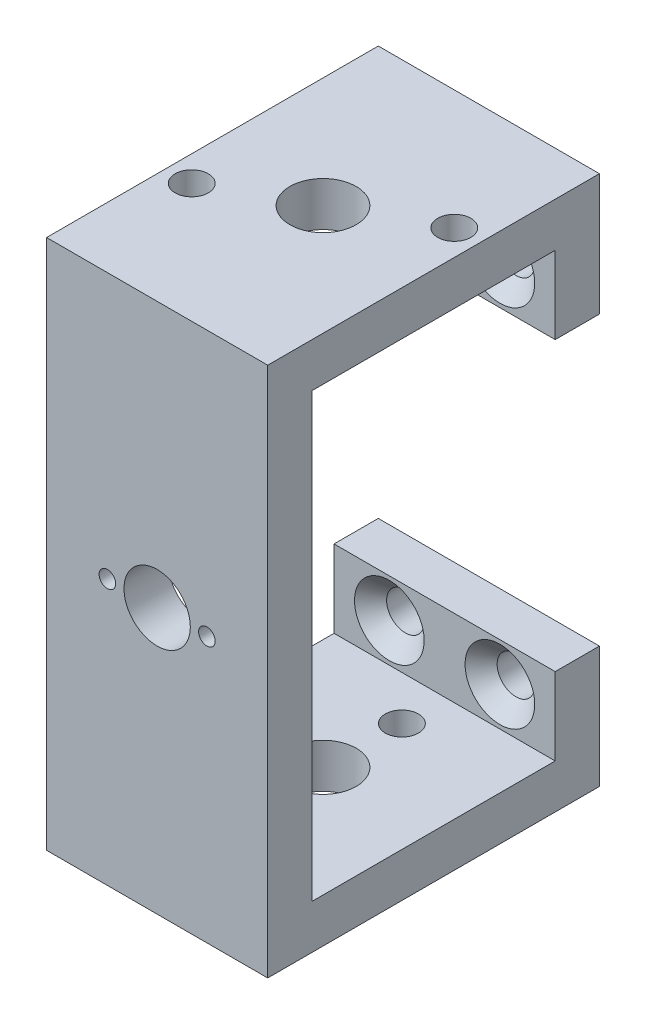
ISO-10303-21;
HEADER;
FILE_DESCRIPTION(('STEP AP214'),'2;1');
FILE_NAME('part.step','',(''),(''),'','','');
FILE_SCHEMA(('AUTOMOTIVE_DESIGN { 1 0 10303 214 1 1 1 1 }'));
ENDSEC;
DATA;
#1=APPLICATION_CONTEXT('core data for automotive mechanical design processes');
#2=APPLICATION_PROTOCOL_DEFINITION('international standard','automotive_design',2000,#1);
#3=PRODUCT_CONTEXT('',#1,'mechanical');
#4=PRODUCT('Part','Part','',(#3));
#5=PRODUCT_RELATED_PRODUCT_CATEGORY('part','',(#4));
#6=PRODUCT_DEFINITION_FORMATION('','',#4);
#7=PRODUCT_DEFINITION_CONTEXT('part definition',#1,'design');
#8=PRODUCT_DEFINITION('design','',#6,#7);
#9=PRODUCT_DEFINITION_SHAPE('','',#8);
#10=(LENGTH_UNIT() NAMED_UNIT(*) SI_UNIT(.MILLI.,.METRE.));
#11=(NAMED_UNIT(*) PLANE_ANGLE_UNIT() SI_UNIT($,.RADIAN.));
#12=(NAMED_UNIT(*) SI_UNIT($,.STERADIAN.) SOLID_ANGLE_UNIT());
#13=UNCERTAINTY_MEASURE_WITH_UNIT(LENGTH_MEASURE(1.E-05),#10,'distance_accuracy_value','');
#14=(GEOMETRIC_REPRESENTATION_CONTEXT(3) GLOBAL_UNCERTAINTY_ASSIGNED_CONTEXT((#13)) GLOBAL_UNIT_ASSIGNED_CONTEXT((#10,
#11,#12)) REPRESENTATION_CONTEXT('',''));
#15=CARTESIAN_POINT('',(0.,0.,0.));
#16=DIRECTION('',(0.,0.,1.));
#17=DIRECTION('',(1.,0.,0.));
#18=AXIS2_PLACEMENT_3D('',#15,#16,#17);
#19=CARTESIAN_POINT('',(20.,-34.,15.));
#20=DIRECTION('',(0.,1.,0.));
#21=DIRECTION('',(0.,0.,1.));
#22=AXIS2_PLACEMENT_3D('',#19,#20,#21);
#23=PLANE('',#22);
#24=CARTESIAN_POINT('',(9.86459769736454,-34.,6.9986903215131));
#25=DIRECTION('',(0.,-1.,0.));
#26=DIRECTION('',(0.,0.,-1.));
#27=AXIS2_PLACEMENT_3D('',#24,#25,#26);
#28=CIRCLE('',#27,1.5);
#29=CARTESIAN_POINT('',(9.86459769736454,-34.,5.4986903215131));
#30=VERTEX_POINT('',#29);
#31=EDGE_CURVE('E298',#30,#30,#28,.T.);
#32=ORIENTED_EDGE('',*,*,#31,.F.);
#33=EDGE_LOOP('',(#32));
#34=FACE_BOUND('',#33,.T.);
#35=CARTESIAN_POINT('',(10.1354023026356,-34.,-6.99869032151308));
#36=DIRECTION('',(0.,-1.,0.));
#37=DIRECTION('',(0.,0.,-1.));
#38=AXIS2_PLACEMENT_3D('',#35,#36,#37);
#39=CIRCLE('',#38,1.5);
#40=CARTESIAN_POINT('',(10.1354023026356,-34.,-8.49869032151308));
#41=VERTEX_POINT('',#40);
#42=EDGE_CURVE('E302',#41,#41,#39,.T.);
#43=ORIENTED_EDGE('',*,*,#42,.F.);
#44=EDGE_LOOP('',(#43));
#45=FACE_BOUND('',#44,.T.);
#46=CARTESIAN_POINT('',(10.,-34.,0.));
#47=DIRECTION('',(0.,1.,0.));
#48=DIRECTION('',(0.,0.,1.));
#49=AXIS2_PLACEMENT_3D('',#46,#47,#48);
#50=CIRCLE('',#49,3.);
#51=CARTESIAN_POINT('',(10.,-34.,3.));
#52=VERTEX_POINT('',#51);
#53=EDGE_CURVE('E257',#52,#52,#50,.T.);
#54=ORIENTED_EDGE('',*,*,#53,.T.);
#55=EDGE_LOOP('',(#54));
#56=FACE_BOUND('',#55,.T.);
#57=DIRECTION('',(0.,0.,-1.));
#58=VECTOR('',#57,1.);
#59=CARTESIAN_POINT('',(0.,-34.,15.));
#60=LINE('',#59,#58);
#61=CARTESIAN_POINT('',(0.,-34.,15.));
#62=VERTEX_POINT('',#61);
#63=CARTESIAN_POINT('',(0.,-34.,-15.));
#64=VERTEX_POINT('',#63);
#65=EDGE_CURVE('E184',#62,#64,#60,.T.);
#66=ORIENTED_EDGE('',*,*,#65,.T.);
#67=DIRECTION('',(-1.,0.,0.));
#68=VECTOR('',#67,1.);
#69=CARTESIAN_POINT('',(20.,-34.,-15.));
#70=LINE('',#69,#68);
#71=CARTESIAN_POINT('',(20.,-34.,-15.));
#72=VERTEX_POINT('',#71);
#73=EDGE_CURVE('E43',#72,#64,#70,.T.);
#74=ORIENTED_EDGE('',*,*,#73,.F.);
#75=DIRECTION('',(0.,0.,-1.));
#76=VECTOR('',#75,1.);
#77=CARTESIAN_POINT('',(20.,-34.,15.));
#78=LINE('',#77,#76);
#79=CARTESIAN_POINT('',(20.,-34.,15.));
#80=VERTEX_POINT('',#79);
#81=EDGE_CURVE('E225',#80,#72,#78,.T.);
#82=ORIENTED_EDGE('',*,*,#81,.F.);
#83=DIRECTION('',(-1.,0.,0.));
#84=VECTOR('',#83,1.);
#85=CARTESIAN_POINT('',(20.,-34.,15.));
#86=LINE('',#85,#84);
#87=EDGE_CURVE('E11',#80,#62,#86,.T.);
#88=ORIENTED_EDGE('',*,*,#87,.T.);
#89=EDGE_LOOP('',(#66,#74,#82,#88));
#90=FACE_BOUND('',#89,.T.);
#91=ADVANCED_FACE('F36',(#34,#45,#56,#90),#23,.F.);
#92=CARTESIAN_POINT('',(20.,-34.,-15.));
#93=DIRECTION('',(0.,0.,1.));
#94=DIRECTION('',(0.,-1.,0.));
#95=AXIS2_PLACEMENT_3D('',#92,#93,#94);
#96=PLANE('',#95);
#97=CARTESIAN_POINT('',(5.,-26.5,-15.));
#98=DIRECTION('',(0.,0.,1.));
#99=DIRECTION('',(0.,-1.,0.));
#100=AXIS2_PLACEMENT_3D('',#97,#98,#99);
#101=CIRCLE('',#100,1.7);
#102=CARTESIAN_POINT('',(5.,-28.2,-15.));
#103=VERTEX_POINT('',#102);
#104=EDGE_CURVE('E354',#103,#103,#101,.T.);
#105=ORIENTED_EDGE('',*,*,#104,.T.);
#106=EDGE_LOOP('',(#105));
#107=FACE_BOUND('',#106,.T.);
#108=CARTESIAN_POINT('',(15.,-26.5,-15.));
#109=DIRECTION('',(0.,0.,1.));
#110=DIRECTION('',(0.,-1.,0.));
#111=AXIS2_PLACEMENT_3D('',#108,#109,#110);
#112=CIRCLE('',#111,1.7);
#113=CARTESIAN_POINT('',(15.,-28.2,-15.));
#114=VERTEX_POINT('',#113);
#115=EDGE_CURVE('E345',#114,#114,#112,.T.);
#116=ORIENTED_EDGE('',*,*,#115,.T.);
#117=EDGE_LOOP('',(#116));
#118=FACE_BOUND('',#117,.T.);
#119=DIRECTION('',(0.,1.,0.));
#120=VECTOR('',#119,1.);
#121=CARTESIAN_POINT('',(0.,-34.,-15.));
#122=LINE('',#121,#120);
#123=CARTESIAN_POINT('',(0.,-23.,-15.));
#124=VERTEX_POINT('',#123);
#125=EDGE_CURVE('E178',#64,#124,#122,.T.);
#126=ORIENTED_EDGE('',*,*,#125,.T.);
#127=DIRECTION('',(1.,0.,0.));
#128=VECTOR('',#127,1.);
#129=CARTESIAN_POINT('',(0.,-23.,-15.));
#130=LINE('',#129,#128);
#131=CARTESIAN_POINT('',(20.,-23.,-15.));
#132=VERTEX_POINT('',#131);
#133=EDGE_CURVE('E50',#124,#132,#130,.T.);
#134=ORIENTED_EDGE('',*,*,#133,.T.);
#135=DIRECTION('',(0.,1.,0.));
#136=VECTOR('',#135,1.);
#137=CARTESIAN_POINT('',(20.,-34.,-15.));
#138=LINE('',#137,#136);
#139=EDGE_CURVE('E180',#72,#132,#138,.T.);
#140=ORIENTED_EDGE('',*,*,#139,.F.);
#141=ORIENTED_EDGE('',*,*,#73,.T.);
#142=EDGE_LOOP('',(#126,#134,#140,#141));
#143=FACE_BOUND('',#142,.T.);
#144=ADVANCED_FACE('F177',(#107,#118,#143),#96,.F.);
#145=CARTESIAN_POINT('',(20.,-20.,-11.));
#146=DIRECTION('',(0.,0.,-1.));
#147=DIRECTION('',(0.,1.,0.));
#148=AXIS2_PLACEMENT_3D('',#145,#146,#147);
#149=PLANE('',#148);
#150=CARTESIAN_POINT('',(5.,-26.5,-11.));
#151=DIRECTION('',(0.,0.,1.));
#152=DIRECTION('',(0.,-1.,0.));
#153=AXIS2_PLACEMENT_3D('',#150,#151,#152);
#154=CIRCLE('',#153,3.15);
#155=CARTESIAN_POINT('',(5.,-29.65,-11.));
#156=VERTEX_POINT('',#155);
#157=EDGE_CURVE('E360',#156,#156,#154,.T.);
#158=ORIENTED_EDGE('',*,*,#157,.F.);
#159=EDGE_LOOP('',(#158));
#160=FACE_BOUND('',#159,.T.);
#161=CARTESIAN_POINT('',(15.,-26.5,-11.));
#162=DIRECTION('',(0.,0.,1.));
#163=DIRECTION('',(0.,-1.,0.));
#164=AXIS2_PLACEMENT_3D('',#161,#162,#163);
#165=CIRCLE('',#164,3.15);
#166=CARTESIAN_POINT('',(15.,-29.65,-11.));
#167=VERTEX_POINT('',#166);
#168=EDGE_CURVE('E351',#167,#167,#165,.T.);
#169=ORIENTED_EDGE('',*,*,#168,.F.);
#170=EDGE_LOOP('',(#169));
#171=FACE_BOUND('',#170,.T.);
#172=DIRECTION('',(0.,-1.,0.));
#173=VECTOR('',#172,1.);
#174=CARTESIAN_POINT('',(20.,-20.,-11.));
#175=LINE('',#174,#173);
#176=CARTESIAN_POINT('',(20.,-23.,-11.));
#177=VERTEX_POINT('',#176);
#178=CARTESIAN_POINT('',(20.,-30.,-11.));
#179=VERTEX_POINT('',#178);
#180=EDGE_CURVE('E233',#177,#179,#175,.T.);
#181=ORIENTED_EDGE('',*,*,#180,.F.);
#182=DIRECTION('',(1.,0.,0.));
#183=VECTOR('',#182,1.);
#184=CARTESIAN_POINT('',(0.,-23.,-11.));
#185=LINE('',#184,#183);
#186=CARTESIAN_POINT('',(0.,-23.,-11.));
#187=VERTEX_POINT('',#186);
#188=EDGE_CURVE('E249',#187,#177,#185,.T.);
#189=ORIENTED_EDGE('',*,*,#188,.F.);
#190=DIRECTION('',(0.,-1.,0.));
#191=VECTOR('',#190,1.);
#192=CARTESIAN_POINT('',(0.,-20.,-11.));
#193=LINE('',#192,#191);
#194=CARTESIAN_POINT('',(0.,-30.,-11.));
#195=VERTEX_POINT('',#194);
#196=EDGE_CURVE('E187',#187,#195,#193,.T.);
#197=ORIENTED_EDGE('',*,*,#196,.T.);
#198=DIRECTION('',(-1.,0.,0.));
#199=VECTOR('',#198,1.);
#200=CARTESIAN_POINT('',(20.,-30.,-11.));
#201=LINE('',#200,#199);
#202=EDGE_CURVE('E169',#179,#195,#201,.T.);
#203=ORIENTED_EDGE('',*,*,#202,.F.);
#204=EDGE_LOOP('',(#181,#189,#197,#203));
#205=FACE_BOUND('',#204,.T.);
#206=ADVANCED_FACE('F247',(#160,#171,#205),#149,.F.);
#207=CARTESIAN_POINT('',(20.,-30.,-11.));
#208=DIRECTION('',(0.,-1.,0.));
#209=DIRECTION('',(0.,0.,-1.));
#210=AXIS2_PLACEMENT_3D('',#207,#208,#209);
#211=PLANE('',#210);
#212=CARTESIAN_POINT('',(9.86459769736454,-30.,6.9986903215131));
#213=DIRECTION('',(0.,-1.,0.));
#214=DIRECTION('',(0.,0.,-1.));
#215=AXIS2_PLACEMENT_3D('',#212,#213,#214);
#216=CIRCLE('',#215,1.5);
#217=CARTESIAN_POINT('',(9.86459769736454,-30.,5.4986903215131));
#218=VERTEX_POINT('',#217);
#219=EDGE_CURVE('E304',#218,#218,#216,.F.);
#220=ORIENTED_EDGE('',*,*,#219,.F.);
#221=EDGE_LOOP('',(#220));
#222=FACE_BOUND('',#221,.T.);
#223=CARTESIAN_POINT('',(10.1354023026356,-30.,-6.99869032151308));
#224=DIRECTION('',(0.,-1.,0.));
#225=DIRECTION('',(0.,0.,-1.));
#226=AXIS2_PLACEMENT_3D('',#223,#224,#225);
#227=CIRCLE('',#226,1.5);
#228=CARTESIAN_POINT('',(10.1354023026356,-30.,-8.49869032151308));
#229=VERTEX_POINT('',#228);
#230=EDGE_CURVE('E311',#229,#229,#227,.F.);
#231=ORIENTED_EDGE('',*,*,#230,.F.);
#232=EDGE_LOOP('',(#231));
#233=FACE_BOUND('',#232,.T.);
#234=CARTESIAN_POINT('',(10.,-30.,0.));
#235=DIRECTION('',(0.,-1.,0.));
#236=DIRECTION('',(0.,0.,-1.));
#237=AXIS2_PLACEMENT_3D('',#234,#235,#236);
#238=CIRCLE('',#237,3.);
#239=CARTESIAN_POINT('',(10.,-30.,-3.));
#240=VERTEX_POINT('',#239);
#241=EDGE_CURVE('E266',#240,#240,#238,.T.);
#242=ORIENTED_EDGE('',*,*,#241,.T.);
#243=EDGE_LOOP('',(#242));
#244=FACE_BOUND('',#243,.T.);
#245=DIRECTION('',(0.,0.,1.));
#246=VECTOR('',#245,1.);
#247=CARTESIAN_POINT('',(0.,-30.,-11.));
#248=LINE('',#247,#246);
#249=CARTESIAN_POINT('',(0.,-30.,11.));
#250=VERTEX_POINT('',#249);
#251=EDGE_CURVE('E189',#195,#250,#248,.T.);
#252=ORIENTED_EDGE('',*,*,#251,.T.);
#253=DIRECTION('',(-1.,0.,0.));
#254=VECTOR('',#253,1.);
#255=CARTESIAN_POINT('',(20.,-30.,11.));
#256=LINE('',#255,#254);
#257=CARTESIAN_POINT('',(20.,-30.,11.));
#258=VERTEX_POINT('',#257);
#259=EDGE_CURVE('E166',#258,#250,#256,.T.);
#260=ORIENTED_EDGE('',*,*,#259,.F.);
#261=DIRECTION('',(0.,0.,1.));
#262=VECTOR('',#261,1.);
#263=CARTESIAN_POINT('',(20.,-30.,-11.));
#264=LINE('',#263,#262);
#265=EDGE_CURVE('E235',#179,#258,#264,.T.);
#266=ORIENTED_EDGE('',*,*,#265,.F.);
#267=ORIENTED_EDGE('',*,*,#202,.T.);
#268=EDGE_LOOP('',(#252,#260,#266,#267));
#269=FACE_BOUND('',#268,.T.);
#270=ADVANCED_FACE('F243',(#222,#233,#244,#269),#211,.F.);
#271=CARTESIAN_POINT('',(20.,10.,11.));
#272=DIRECTION('',(0.,0.,1.));
#273=DIRECTION('',(0.,-1.,0.));
#274=AXIS2_PLACEMENT_3D('',#271,#272,#273);
#275=PLANE('',#274);
#276=CARTESIAN_POINT('',(5.49999999999999,-10.,11.));
#277=DIRECTION('',(0.,0.,1.));
#278=DIRECTION('',(0.,-1.,0.));
#279=AXIS2_PLACEMENT_3D('',#276,#277,#278);
#280=CIRCLE('',#279,0.75);
#281=CARTESIAN_POINT('',(5.49999999999999,-10.75,11.));
#282=VERTEX_POINT('',#281);
#283=EDGE_CURVE('E363',#282,#282,#280,.T.);
#284=ORIENTED_EDGE('',*,*,#283,.T.);
#285=EDGE_LOOP('',(#284));
#286=FACE_BOUND('',#285,.T.);
#287=CARTESIAN_POINT('',(14.5,-10.,11.));
#288=DIRECTION('',(0.,0.,1.));
#289=DIRECTION('',(0.,-1.,0.));
#290=AXIS2_PLACEMENT_3D('',#287,#288,#289);
#291=CIRCLE('',#290,0.75);
#292=CARTESIAN_POINT('',(14.5,-10.75,11.));
#293=VERTEX_POINT('',#292);
#294=EDGE_CURVE('E365',#293,#293,#291,.T.);
#295=ORIENTED_EDGE('',*,*,#294,.T.);
#296=EDGE_LOOP('',(#295));
#297=FACE_BOUND('',#296,.T.);
#298=CARTESIAN_POINT('',(10.,-10.,11.));
#299=DIRECTION('',(0.,0.,-1.));
#300=DIRECTION('',(0.,1.,0.));
#301=AXIS2_PLACEMENT_3D('',#298,#299,#300);
#302=CIRCLE('',#301,3.);
#303=CARTESIAN_POINT('',(10.,-7.,11.));
#304=VERTEX_POINT('',#303);
#305=EDGE_CURVE('E229',#304,#304,#302,.T.);
#306=ORIENTED_EDGE('',*,*,#305,.F.);
#307=EDGE_LOOP('',(#306));
#308=FACE_BOUND('',#307,.T.);
#309=DIRECTION('',(0.,1.,0.));
#310=VECTOR('',#309,1.);
#311=CARTESIAN_POINT('',(0.,10.,11.));
#312=LINE('',#311,#310);
#313=CARTESIAN_POINT('',(0.,10.,11.));
#314=VERTEX_POINT('',#313);
#315=EDGE_CURVE('E197',#250,#314,#312,.T.);
#316=ORIENTED_EDGE('',*,*,#315,.T.);
#317=DIRECTION('',(-1.,0.,0.));
#318=VECTOR('',#317,1.);
#319=CARTESIAN_POINT('',(20.,10.,11.));
#320=LINE('',#319,#318);
#321=CARTESIAN_POINT('',(20.,10.,11.));
#322=VERTEX_POINT('',#321);
#323=EDGE_CURVE('E163',#322,#314,#320,.T.);
#324=ORIENTED_EDGE('',*,*,#323,.F.);
#325=DIRECTION('',(0.,1.,0.));
#326=VECTOR('',#325,1.);
#327=CARTESIAN_POINT('',(20.,0.,11.));
#328=LINE('',#327,#326);
#329=EDGE_CURVE('E213',#258,#322,#328,.T.);
#330=ORIENTED_EDGE('',*,*,#329,.F.);
#331=ORIENTED_EDGE('',*,*,#259,.T.);
#332=EDGE_LOOP('',(#316,#324,#330,#331));
#333=FACE_BOUND('',#332,.T.);
#334=ADVANCED_FACE('F240',(#286,#297,#308,#333),#275,.F.);
#335=CARTESIAN_POINT('',(20.,10.,-11.));
#336=DIRECTION('',(0.,1.,0.));
#337=DIRECTION('',(0.,0.,1.));
#338=AXIS2_PLACEMENT_3D('',#335,#336,#337);
#339=PLANE('',#338);
#340=CARTESIAN_POINT('',(17.6795896515513,9.99999999999999,-4.19361452495285));
#341=DIRECTION('',(0.,1.,0.));
#342=DIRECTION('',(0.,0.,1.));
#343=AXIS2_PLACEMENT_3D('',#340,#341,#342);
#344=CIRCLE('',#343,1.5);
#345=CARTESIAN_POINT('',(17.6795896515513,9.99999999999999,-2.69361452495285));
#346=VERTEX_POINT('',#345);
#347=EDGE_CURVE('E319',#346,#346,#344,.F.);
#348=ORIENTED_EDGE('',*,*,#347,.F.);
#349=EDGE_LOOP('',(#348));
#350=FACE_BOUND('',#349,.T.);
#351=CARTESIAN_POINT('',(2.32041034844555,9.99999999999999,4.19361452492107));
#352=DIRECTION('',(0.,1.,0.));
#353=DIRECTION('',(0.,0.,1.));
#354=AXIS2_PLACEMENT_3D('',#351,#352,#353);
#355=CIRCLE('',#354,1.5);
#356=CARTESIAN_POINT('',(2.32041034844555,9.99999999999999,5.69361452492107));
#357=VERTEX_POINT('',#356);
#358=EDGE_CURVE('E320',#357,#357,#355,.F.);
#359=ORIENTED_EDGE('',*,*,#358,.F.);
#360=EDGE_LOOP('',(#359));
#361=FACE_BOUND('',#360,.T.);
#362=CARTESIAN_POINT('',(10.,9.99999999999999,0.));
#363=DIRECTION('',(0.,1.,0.));
#364=DIRECTION('',(0.,0.,1.));
#365=AXIS2_PLACEMENT_3D('',#362,#363,#364);
#366=CIRCLE('',#365,3.);
#367=CARTESIAN_POINT('',(10.,9.99999999999999,3.));
#368=VERTEX_POINT('',#367);
#369=EDGE_CURVE('E260',#368,#368,#366,.T.);
#370=ORIENTED_EDGE('',*,*,#369,.T.);
#371=EDGE_LOOP('',(#370));
#372=FACE_BOUND('',#371,.T.);
#373=DIRECTION('',(0.,0.,-1.));
#374=VECTOR('',#373,1.);
#375=CARTESIAN_POINT('',(0.,10.,-11.));
#376=LINE('',#375,#374);
#377=CARTESIAN_POINT('',(0.,10.,-11.));
#378=VERTEX_POINT('',#377);
#379=EDGE_CURVE('E148',#314,#378,#376,.T.);
#380=ORIENTED_EDGE('',*,*,#379,.T.);
#381=DIRECTION('',(-1.,0.,0.));
#382=VECTOR('',#381,1.);
#383=CARTESIAN_POINT('',(20.,10.,-11.));
#384=LINE('',#383,#382);
#385=CARTESIAN_POINT('',(20.,10.,-11.));
#386=VERTEX_POINT('',#385);
#387=EDGE_CURVE('E160',#386,#378,#384,.T.);
#388=ORIENTED_EDGE('',*,*,#387,.F.);
#389=DIRECTION('',(0.,0.,-1.));
#390=VECTOR('',#389,1.);
#391=CARTESIAN_POINT('',(20.,10.,-11.));
#392=LINE('',#391,#390);
#393=EDGE_CURVE('E210',#322,#386,#392,.T.);
#394=ORIENTED_EDGE('',*,*,#393,.F.);
#395=ORIENTED_EDGE('',*,*,#323,.T.);
#396=EDGE_LOOP('',(#380,#388,#394,#395));
#397=FACE_BOUND('',#396,.T.);
#398=ADVANCED_FACE('F201',(#350,#361,#372,#397),#339,.F.);
#399=CARTESIAN_POINT('',(20.,0.,-11.));
#400=DIRECTION('',(0.,0.,-1.));
#401=DIRECTION('',(0.,1.,0.));
#402=AXIS2_PLACEMENT_3D('',#399,#400,#401);
#403=PLANE('',#402);
#404=CARTESIAN_POINT('',(5.,6.5,-11.));
#405=DIRECTION('',(0.,0.,1.));
#406=DIRECTION('',(0.,-1.,0.));
#407=AXIS2_PLACEMENT_3D('',#404,#405,#406);
#408=CIRCLE('',#407,3.15);
#409=CARTESIAN_POINT('',(5.,3.35,-11.));
#410=VERTEX_POINT('',#409);
#411=EDGE_CURVE('E342',#410,#410,#408,.T.);
#412=ORIENTED_EDGE('',*,*,#411,.F.);
#413=EDGE_LOOP('',(#412));
#414=FACE_BOUND('',#413,.T.);
#415=CARTESIAN_POINT('',(15.,6.5,-11.));
#416=DIRECTION('',(0.,0.,1.));
#417=DIRECTION('',(0.,-1.,0.));
#418=AXIS2_PLACEMENT_3D('',#415,#416,#417);
#419=CIRCLE('',#418,3.15);
#420=CARTESIAN_POINT('',(15.,3.35,-11.));
#421=VERTEX_POINT('',#420);
#422=EDGE_CURVE('E333',#421,#421,#419,.T.);
#423=ORIENTED_EDGE('',*,*,#422,.F.);
#424=EDGE_LOOP('',(#423));
#425=FACE_BOUND('',#424,.T.);
#426=DIRECTION('',(0.,-1.,0.));
#427=VECTOR('',#426,1.);
#428=CARTESIAN_POINT('',(0.,0.,-11.));
#429=LINE('',#428,#427);
#430=CARTESIAN_POINT('',(0.,3.,-11.));
#431=VERTEX_POINT('',#430);
#432=EDGE_CURVE('E144',#378,#431,#429,.T.);
#433=ORIENTED_EDGE('',*,*,#432,.T.);
#434=DIRECTION('',(1.,0.,0.));
#435=VECTOR('',#434,1.);
#436=CARTESIAN_POINT('',(0.,3.,-11.));
#437=LINE('',#436,#435);
#438=CARTESIAN_POINT('',(20.,3.,-11.));
#439=VERTEX_POINT('',#438);
#440=EDGE_CURVE('E58',#431,#439,#437,.T.);
#441=ORIENTED_EDGE('',*,*,#440,.T.);
#442=DIRECTION('',(0.,-1.,0.));
#443=VECTOR('',#442,1.);
#444=CARTESIAN_POINT('',(20.,0.,-11.));
#445=LINE('',#444,#443);
#446=EDGE_CURVE('E208',#386,#439,#445,.T.);
#447=ORIENTED_EDGE('',*,*,#446,.F.);
#448=ORIENTED_EDGE('',*,*,#387,.T.);
#449=EDGE_LOOP('',(#433,#441,#447,#448));
#450=FACE_BOUND('',#449,.T.);
#451=ADVANCED_FACE('F206',(#414,#425,#450),#403,.F.);
#452=CARTESIAN_POINT('',(20.,14.,-15.));
#453=DIRECTION('',(0.,0.,1.));
#454=DIRECTION('',(1.,0.,0.));
#455=AXIS2_PLACEMENT_3D('',#452,#453,#454);
#456=PLANE('',#455);
#457=CARTESIAN_POINT('',(5.,6.5,-15.));
#458=DIRECTION('',(0.,0.,1.));
#459=DIRECTION('',(0.,-1.,0.));
#460=AXIS2_PLACEMENT_3D('',#457,#458,#459);
#461=CIRCLE('',#460,1.7);
#462=CARTESIAN_POINT('',(5.,4.80000000000001,-15.));
#463=VERTEX_POINT('',#462);
#464=EDGE_CURVE('E336',#463,#463,#461,.T.);
#465=ORIENTED_EDGE('',*,*,#464,.T.);
#466=EDGE_LOOP('',(#465));
#467=FACE_BOUND('',#466,.T.);
#468=CARTESIAN_POINT('',(15.,6.5,-15.));
#469=DIRECTION('',(0.,0.,1.));
#470=DIRECTION('',(0.,-1.,0.));
#471=AXIS2_PLACEMENT_3D('',#468,#469,#470);
#472=CIRCLE('',#471,1.7);
#473=CARTESIAN_POINT('',(15.,4.8,-15.));
#474=VERTEX_POINT('',#473);
#475=EDGE_CURVE('E323',#474,#474,#472,.T.);
#476=ORIENTED_EDGE('',*,*,#475,.T.);
#477=EDGE_LOOP('',(#476));
#478=FACE_BOUND('',#477,.T.);
#479=DIRECTION('',(0.,1.,0.));
#480=VECTOR('',#479,1.);
#481=CARTESIAN_POINT('',(20.,14.,-15.));
#482=LINE('',#481,#480);
#483=CARTESIAN_POINT('',(20.,3.,-15.));
#484=VERTEX_POINT('',#483);
#485=CARTESIAN_POINT('',(20.,14.,-15.));
#486=VERTEX_POINT('',#485);
#487=EDGE_CURVE('E138',#484,#486,#482,.T.);
#488=ORIENTED_EDGE('',*,*,#487,.F.);
#489=DIRECTION('',(1.,0.,0.));
#490=VECTOR('',#489,1.);
#491=CARTESIAN_POINT('',(0.,3.,-15.));
#492=LINE('',#491,#490);
#493=CARTESIAN_POINT('',(0.,3.,-15.));
#494=VERTEX_POINT('',#493);
#495=EDGE_CURVE('E124',#494,#484,#492,.T.);
#496=ORIENTED_EDGE('',*,*,#495,.F.);
#497=DIRECTION('',(0.,1.,0.));
#498=VECTOR('',#497,1.);
#499=CARTESIAN_POINT('',(0.,14.,-15.));
#500=LINE('',#499,#498);
#501=CARTESIAN_POINT('',(0.,14.,-15.));
#502=VERTEX_POINT('',#501);
#503=EDGE_CURVE('E136',#494,#502,#500,.T.);
#504=ORIENTED_EDGE('',*,*,#503,.T.);
#505=DIRECTION('',(-1.,0.,0.));
#506=VECTOR('',#505,1.);
#507=CARTESIAN_POINT('',(20.,14.,-15.));
#508=LINE('',#507,#506);
#509=EDGE_CURVE('E157',#486,#502,#508,.T.);
#510=ORIENTED_EDGE('',*,*,#509,.F.);
#511=EDGE_LOOP('',(#488,#496,#504,#510));
#512=FACE_BOUND('',#511,.T.);
#513=ADVANCED_FACE('F134',(#467,#478,#512),#456,.F.);
#514=CARTESIAN_POINT('',(20.,14.,15.));
#515=DIRECTION('',(0.,-1.,0.));
#516=DIRECTION('',(0.,0.,-1.));
#517=AXIS2_PLACEMENT_3D('',#514,#515,#516);
#518=PLANE('',#517);
#519=CARTESIAN_POINT('',(17.6795896515513,14.,-4.19361452495285));
#520=DIRECTION('',(0.,1.,0.));
#521=DIRECTION('',(0.,0.,1.));
#522=AXIS2_PLACEMENT_3D('',#519,#520,#521);
#523=CIRCLE('',#522,1.5);
#524=CARTESIAN_POINT('',(17.6795896515513,14.,-2.69361452495285));
#525=VERTEX_POINT('',#524);
#526=EDGE_CURVE('E312',#525,#525,#523,.T.);
#527=ORIENTED_EDGE('',*,*,#526,.F.);
#528=EDGE_LOOP('',(#527));
#529=FACE_BOUND('',#528,.T.);
#530=CARTESIAN_POINT('',(2.32041034844555,14.,4.19361452492107));
#531=DIRECTION('',(0.,1.,0.));
#532=DIRECTION('',(0.,0.,1.));
#533=AXIS2_PLACEMENT_3D('',#530,#531,#532);
#534=CIRCLE('',#533,1.5);
#535=CARTESIAN_POINT('',(2.32041034844555,14.,5.69361452492107));
#536=VERTEX_POINT('',#535);
#537=EDGE_CURVE('E316',#536,#536,#534,.T.);
#538=ORIENTED_EDGE('',*,*,#537,.F.);
#539=EDGE_LOOP('',(#538));
#540=FACE_BOUND('',#539,.T.);
#541=CARTESIAN_POINT('',(10.,14.,0.));
#542=DIRECTION('',(0.,1.,0.));
#543=DIRECTION('',(0.,0.,1.));
#544=AXIS2_PLACEMENT_3D('',#541,#542,#543);
#545=CIRCLE('',#544,3.);
#546=CARTESIAN_POINT('',(10.,14.,3.));
#547=VERTEX_POINT('',#546);
#548=EDGE_CURVE('E261',#547,#547,#545,.T.);
#549=ORIENTED_EDGE('',*,*,#548,.F.);
#550=EDGE_LOOP('',(#549));
#551=FACE_BOUND('',#550,.T.);
#552=DIRECTION('',(0.,0.,1.));
#553=VECTOR('',#552,1.);
#554=CARTESIAN_POINT('',(0.,14.,15.));
#555=LINE('',#554,#553);
#556=CARTESIAN_POINT('',(0.,14.,15.));
#557=VERTEX_POINT('',#556);
#558=EDGE_CURVE('E143',#502,#557,#555,.T.);
#559=ORIENTED_EDGE('',*,*,#558,.T.);
#560=DIRECTION('',(-1.,0.,0.));
#561=VECTOR('',#560,1.);
#562=CARTESIAN_POINT('',(20.,14.,15.));
#563=LINE('',#562,#561);
#564=CARTESIAN_POINT('',(20.,14.,15.));
#565=VERTEX_POINT('',#564);
#566=EDGE_CURVE('E154',#565,#557,#563,.T.);
#567=ORIENTED_EDGE('',*,*,#566,.F.);
#568=DIRECTION('',(0.,0.,1.));
#569=VECTOR('',#568,1.);
#570=CARTESIAN_POINT('',(20.,14.,15.));
#571=LINE('',#570,#569);
#572=EDGE_CURVE('E158',#486,#565,#571,.T.);
#573=ORIENTED_EDGE('',*,*,#572,.F.);
#574=ORIENTED_EDGE('',*,*,#509,.T.);
#575=EDGE_LOOP('',(#559,#567,#573,#574));
#576=FACE_BOUND('',#575,.T.);
#577=ADVANCED_FACE('F222',(#529,#540,#551,#576),#518,.F.);
#578=CARTESIAN_POINT('',(20.,0.,15.));
#579=DIRECTION('',(0.,0.,-1.));
#580=DIRECTION('',(0.,1.,0.));
#581=AXIS2_PLACEMENT_3D('',#578,#579,#580);
#582=PLANE('',#581);
#583=CARTESIAN_POINT('',(5.49999999999999,-10.,15.));
#584=DIRECTION('',(0.,0.,1.));
#585=DIRECTION('',(1.,0.,0.));
#586=AXIS2_PLACEMENT_3D('',#583,#584,#585);
#587=CIRCLE('',#586,0.75);
#588=CARTESIAN_POINT('',(6.24999999999999,-10.,15.));
#589=VERTEX_POINT('',#588);
#590=EDGE_CURVE('E368',#589,#589,#587,.T.);
#591=ORIENTED_EDGE('',*,*,#590,.F.);
#592=EDGE_LOOP('',(#591));
#593=FACE_BOUND('',#592,.T.);
#594=CARTESIAN_POINT('',(14.5,-10.,15.));
#595=DIRECTION('',(0.,0.,1.));
#596=DIRECTION('',(1.,0.,0.));
#597=AXIS2_PLACEMENT_3D('',#594,#595,#596);
#598=CIRCLE('',#597,0.75);
#599=CARTESIAN_POINT('',(15.25,-10.,15.));
#600=VERTEX_POINT('',#599);
#601=EDGE_CURVE('E369',#600,#600,#598,.T.);
#602=ORIENTED_EDGE('',*,*,#601,.F.);
#603=EDGE_LOOP('',(#602));
#604=FACE_BOUND('',#603,.T.);
#605=CARTESIAN_POINT('',(10.,-10.,15.));
#606=DIRECTION('',(0.,0.,-1.));
#607=DIRECTION('',(0.,1.,0.));
#608=AXIS2_PLACEMENT_3D('',#605,#606,#607);
#609=CIRCLE('',#608,3.);
#610=CARTESIAN_POINT('',(10.,-7.,15.));
#611=VERTEX_POINT('',#610);
#612=EDGE_CURVE('E191',#611,#611,#609,.T.);
#613=ORIENTED_EDGE('',*,*,#612,.T.);
#614=EDGE_LOOP('',(#613));
#615=FACE_BOUND('',#614,.T.);
#616=DIRECTION('',(0.,-1.,0.));
#617=VECTOR('',#616,1.);
#618=CARTESIAN_POINT('',(0.,0.,15.));
#619=LINE('',#618,#617);
#620=EDGE_CURVE('E146',#557,#62,#619,.T.);
#621=ORIENTED_EDGE('',*,*,#620,.T.);
#622=ORIENTED_EDGE('',*,*,#87,.F.);
#623=DIRECTION('',(0.,-1.,0.));
#624=VECTOR('',#623,1.);
#625=CARTESIAN_POINT('',(20.,0.,15.));
#626=LINE('',#625,#624);
#627=EDGE_CURVE('E153',#565,#80,#626,.T.);
#628=ORIENTED_EDGE('',*,*,#627,.F.);
#629=ORIENTED_EDGE('',*,*,#566,.T.);
#630=EDGE_LOOP('',(#621,#622,#628,#629));
#631=FACE_BOUND('',#630,.T.);
#632=ADVANCED_FACE('F224',(#593,#604,#615,#631),#582,.F.);
#633=CARTESIAN_POINT('',(20.,0.,0.));
#634=DIRECTION('',(1.,0.,0.));
#635=DIRECTION('',(0.,0.,-1.));
#636=AXIS2_PLACEMENT_3D('',#633,#634,#635);
#637=PLANE('',#636);
#638=DIRECTION('',(0.,0.,1.));
#639=VECTOR('',#638,1.);
#640=CARTESIAN_POINT('',(20.,3.,-11.));
#641=LINE('',#640,#639);
#642=EDGE_CURVE('E130',#484,#439,#641,.T.);
#643=ORIENTED_EDGE('',*,*,#642,.F.);
#644=ORIENTED_EDGE('',*,*,#487,.T.);
#645=ORIENTED_EDGE('',*,*,#572,.T.);
#646=ORIENTED_EDGE('',*,*,#627,.T.);
#647=ORIENTED_EDGE('',*,*,#81,.T.);
#648=ORIENTED_EDGE('',*,*,#139,.T.);
#649=DIRECTION('',(0.,0.,-1.));
#650=VECTOR('',#649,1.);
#651=CARTESIAN_POINT('',(20.,-23.,-11.));
#652=LINE('',#651,#650);
#653=EDGE_CURVE('E253',#177,#132,#652,.T.);
#654=ORIENTED_EDGE('',*,*,#653,.F.);
#655=ORIENTED_EDGE('',*,*,#180,.T.);
#656=ORIENTED_EDGE('',*,*,#265,.T.);
#657=ORIENTED_EDGE('',*,*,#329,.T.);
#658=ORIENTED_EDGE('',*,*,#393,.T.);
#659=ORIENTED_EDGE('',*,*,#446,.T.);
#660=EDGE_LOOP('',(#643,#644,#645,#646,#647,#648,#654,#655,#656,#657,#658,#659));
#661=FACE_BOUND('',#660,.T.);
#662=ADVANCED_FACE('F219',(#661),#637,.T.);
#663=CARTESIAN_POINT('',(0.,0.,0.));
#664=DIRECTION('',(1.,0.,0.));
#665=DIRECTION('',(0.,0.,-1.));
#666=AXIS2_PLACEMENT_3D('',#663,#664,#665);
#667=PLANE('',#666);
#668=ORIENTED_EDGE('',*,*,#503,.F.);
#669=DIRECTION('',(0.,0.,1.));
#670=VECTOR('',#669,1.);
#671=CARTESIAN_POINT('',(0.,3.,-11.));
#672=LINE('',#671,#670);
#673=EDGE_CURVE('E121',#494,#431,#672,.T.);
#674=ORIENTED_EDGE('',*,*,#673,.T.);
#675=ORIENTED_EDGE('',*,*,#432,.F.);
#676=ORIENTED_EDGE('',*,*,#379,.F.);
#677=ORIENTED_EDGE('',*,*,#315,.F.);
#678=ORIENTED_EDGE('',*,*,#251,.F.);
#679=ORIENTED_EDGE('',*,*,#196,.F.);
#680=DIRECTION('',(0.,0.,-1.));
#681=VECTOR('',#680,1.);
#682=CARTESIAN_POINT('',(0.,-23.,-11.));
#683=LINE('',#682,#681);
#684=EDGE_CURVE('E186',#187,#124,#683,.T.);
#685=ORIENTED_EDGE('',*,*,#684,.T.);
#686=ORIENTED_EDGE('',*,*,#125,.F.);
#687=ORIENTED_EDGE('',*,*,#65,.F.);
#688=ORIENTED_EDGE('',*,*,#620,.F.);
#689=ORIENTED_EDGE('',*,*,#558,.F.);
#690=EDGE_LOOP('',(#668,#674,#675,#676,#677,#678,#679,#685,#686,#687,#688,#689));
#691=FACE_BOUND('',#690,.T.);
#692=ADVANCED_FACE('F141',(#691),#667,.F.);
#693=CARTESIAN_POINT('',(10.,-10.,15.));
#694=DIRECTION('',(0.,0.,-1.));
#695=DIRECTION('',(0.,1.,0.));
#696=AXIS2_PLACEMENT_3D('',#693,#694,#695);
#697=CYLINDRICAL_SURFACE('',#696,3.);
#698=ORIENTED_EDGE('',*,*,#612,.F.);
#699=EDGE_LOOP('',(#698));
#700=FACE_BOUND('',#699,.T.);
#701=ORIENTED_EDGE('',*,*,#305,.T.);
#702=EDGE_LOOP('',(#701));
#703=FACE_BOUND('',#702,.T.);
#704=ADVANCED_FACE('F274',(#700,#703),#697,.F.);
#705=CARTESIAN_POINT('',(10.,-34.,0.));
#706=DIRECTION('',(0.,1.,0.));
#707=DIRECTION('',(0.,0.,1.));
#708=AXIS2_PLACEMENT_3D('',#705,#706,#707);
#709=CYLINDRICAL_SURFACE('',#708,3.);
#710=ORIENTED_EDGE('',*,*,#548,.T.);
#711=EDGE_LOOP('',(#710));
#712=FACE_BOUND('',#711,.T.);
#713=ORIENTED_EDGE('',*,*,#369,.F.);
#714=EDGE_LOOP('',(#713));
#715=FACE_BOUND('',#714,.T.);
#716=ADVANCED_FACE('F449',(#712,#715),#709,.F.);
#717=ORIENTED_EDGE('',*,*,#53,.F.);
#718=EDGE_LOOP('',(#717));
#719=FACE_BOUND('',#718,.T.);
#720=ORIENTED_EDGE('',*,*,#241,.F.);
#721=EDGE_LOOP('',(#720));
#722=FACE_BOUND('',#721,.T.);
#723=ADVANCED_FACE('F446',(#719,#722),#709,.F.);
#724=CARTESIAN_POINT('',(0.,-23.,-11.));
#725=DIRECTION('',(0.,-1.,0.));
#726=DIRECTION('',(0.,0.,-1.));
#727=AXIS2_PLACEMENT_3D('',#724,#725,#726);
#728=PLANE('',#727);
#729=ORIENTED_EDGE('',*,*,#653,.T.);
#730=ORIENTED_EDGE('',*,*,#133,.F.);
#731=ORIENTED_EDGE('',*,*,#684,.F.);
#732=ORIENTED_EDGE('',*,*,#188,.T.);
#733=EDGE_LOOP('',(#729,#730,#731,#732));
#734=FACE_BOUND('',#733,.T.);
#735=ADVANCED_FACE('F443',(#734),#728,.F.);
#736=CARTESIAN_POINT('',(0.,3.,-11.));
#737=DIRECTION('',(0.,1.,0.));
#738=DIRECTION('',(0.,0.,1.));
#739=AXIS2_PLACEMENT_3D('',#736,#737,#738);
#740=PLANE('',#739);
#741=ORIENTED_EDGE('',*,*,#642,.T.);
#742=ORIENTED_EDGE('',*,*,#440,.F.);
#743=ORIENTED_EDGE('',*,*,#673,.F.);
#744=ORIENTED_EDGE('',*,*,#495,.T.);
#745=EDGE_LOOP('',(#741,#742,#743,#744));
#746=FACE_BOUND('',#745,.T.);
#747=ADVANCED_FACE('F123',(#746),#740,.F.);
#748=CARTESIAN_POINT('',(10.1354023026356,14.001,-6.99869032151308));
#749=DIRECTION('',(0.,-1.,0.));
#750=DIRECTION('',(0.,0.,-1.));
#751=AXIS2_PLACEMENT_3D('',#748,#749,#750);
#752=CYLINDRICAL_SURFACE('',#751,1.5);
#753=ORIENTED_EDGE('',*,*,#42,.T.);
#754=EDGE_LOOP('',(#753));
#755=FACE_BOUND('',#754,.T.);
#756=ORIENTED_EDGE('',*,*,#230,.T.);
#757=EDGE_LOOP('',(#756));
#758=FACE_BOUND('',#757,.T.);
#759=ADVANCED_FACE('F436',(#755,#758),#752,.F.);
#760=CARTESIAN_POINT('',(9.86459769736454,14.001,6.9986903215131));
#761=DIRECTION('',(0.,-1.,0.));
#762=DIRECTION('',(0.,0.,-1.));
#763=AXIS2_PLACEMENT_3D('',#760,#761,#762);
#764=CYLINDRICAL_SURFACE('',#763,1.5);
#765=ORIENTED_EDGE('',*,*,#31,.T.);
#766=EDGE_LOOP('',(#765));
#767=FACE_BOUND('',#766,.T.);
#768=ORIENTED_EDGE('',*,*,#219,.T.);
#769=EDGE_LOOP('',(#768));
#770=FACE_BOUND('',#769,.T.);
#771=ADVANCED_FACE('F432',(#767,#770),#764,.F.);
#772=CARTESIAN_POINT('',(2.32041034844555,-34.001,4.19361452492107));
#773=DIRECTION('',(0.,1.,0.));
#774=DIRECTION('',(0.,0.,1.));
#775=AXIS2_PLACEMENT_3D('',#772,#773,#774);
#776=CYLINDRICAL_SURFACE('',#775,1.5);
#777=ORIENTED_EDGE('',*,*,#537,.T.);
#778=EDGE_LOOP('',(#777));
#779=FACE_BOUND('',#778,.T.);
#780=ORIENTED_EDGE('',*,*,#358,.T.);
#781=EDGE_LOOP('',(#780));
#782=FACE_BOUND('',#781,.T.);
#783=ADVANCED_FACE('F428',(#779,#782),#776,.F.);
#784=CARTESIAN_POINT('',(17.6795896515513,-34.001,-4.19361452495285));
#785=DIRECTION('',(0.,1.,0.));
#786=DIRECTION('',(0.,0.,1.));
#787=AXIS2_PLACEMENT_3D('',#784,#785,#786);
#788=CYLINDRICAL_SURFACE('',#787,1.5);
#789=ORIENTED_EDGE('',*,*,#526,.T.);
#790=EDGE_LOOP('',(#789));
#791=FACE_BOUND('',#790,.T.);
#792=ORIENTED_EDGE('',*,*,#347,.T.);
#793=EDGE_LOOP('',(#792));
#794=FACE_BOUND('',#793,.T.);
#795=ADVANCED_FACE('F424',(#791,#794),#788,.F.);
#796=CARTESIAN_POINT('',(15.,6.5,-11.));
#797=DIRECTION('',(0.,0.,1.));
#798=DIRECTION('',(0.,-1.,0.));
#799=AXIS2_PLACEMENT_3D('',#796,#797,#798);
#800=CYLINDRICAL_SURFACE('',#799,1.7);
#801=ORIENTED_EDGE('',*,*,#475,.F.);
#802=EDGE_LOOP('',(#801));
#803=FACE_BOUND('',#802,.T.);
#804=CARTESIAN_POINT('',(15.,6.5,-12.45));
#805=DIRECTION('',(0.,0.,1.));
#806=DIRECTION('',(0.,-1.,0.));
#807=AXIS2_PLACEMENT_3D('',#804,#805,#806);
#808=CIRCLE('',#807,1.7);
#809=CARTESIAN_POINT('',(15.,4.8,-12.45));
#810=VERTEX_POINT('',#809);
#811=EDGE_CURVE('E330',#810,#810,#808,.T.);
#812=ORIENTED_EDGE('',*,*,#811,.T.);
#813=EDGE_LOOP('',(#812));
#814=FACE_BOUND('',#813,.T.);
#815=ADVANCED_FACE('F420',(#803,#814),#800,.F.);
#816=CARTESIAN_POINT('',(15.,6.5,-11.));
#817=DIRECTION('',(0.,0.,1.));
#818=DIRECTION('',(0.,-1.,0.));
#819=AXIS2_PLACEMENT_3D('',#816,#817,#818);
#820=CONICAL_SURFACE('',#819,3.15,0.785398163397448);
#821=ORIENTED_EDGE('',*,*,#811,.F.);
#822=EDGE_LOOP('',(#821));
#823=FACE_BOUND('',#822,.T.);
#824=ORIENTED_EDGE('',*,*,#422,.T.);
#825=EDGE_LOOP('',(#824));
#826=FACE_BOUND('',#825,.T.);
#827=ADVANCED_FACE('F416',(#823,#826),#820,.F.);
#828=CARTESIAN_POINT('',(5.,6.5,-11.));
#829=DIRECTION('',(0.,0.,1.));
#830=DIRECTION('',(0.,-1.,0.));
#831=AXIS2_PLACEMENT_3D('',#828,#829,#830);
#832=CYLINDRICAL_SURFACE('',#831,1.7);
#833=ORIENTED_EDGE('',*,*,#464,.F.);
#834=EDGE_LOOP('',(#833));
#835=FACE_BOUND('',#834,.T.);
#836=CARTESIAN_POINT('',(5.,6.5,-12.45));
#837=DIRECTION('',(0.,0.,1.));
#838=DIRECTION('',(0.,-1.,0.));
#839=AXIS2_PLACEMENT_3D('',#836,#837,#838);
#840=CIRCLE('',#839,1.7);
#841=CARTESIAN_POINT('',(5.,4.8,-12.45));
#842=VERTEX_POINT('',#841);
#843=EDGE_CURVE('E339',#842,#842,#840,.T.);
#844=ORIENTED_EDGE('',*,*,#843,.T.);
#845=EDGE_LOOP('',(#844));
#846=FACE_BOUND('',#845,.T.);
#847=ADVANCED_FACE('F412',(#835,#846),#832,.F.);
#848=CARTESIAN_POINT('',(5.,6.5,-11.));
#849=DIRECTION('',(0.,0.,1.));
#850=DIRECTION('',(0.,-1.,0.));
#851=AXIS2_PLACEMENT_3D('',#848,#849,#850);
#852=CONICAL_SURFACE('',#851,3.15,0.785398163397448);
#853=ORIENTED_EDGE('',*,*,#843,.F.);
#854=EDGE_LOOP('',(#853));
#855=FACE_BOUND('',#854,.T.);
#856=ORIENTED_EDGE('',*,*,#411,.T.);
#857=EDGE_LOOP('',(#856));
#858=FACE_BOUND('',#857,.T.);
#859=ADVANCED_FACE('F408',(#855,#858),#852,.F.);
#860=CARTESIAN_POINT('',(15.,-26.5,-11.));
#861=DIRECTION('',(0.,0.,1.));
#862=DIRECTION('',(0.,-1.,0.));
#863=AXIS2_PLACEMENT_3D('',#860,#861,#862);
#864=CYLINDRICAL_SURFACE('',#863,1.7);
#865=ORIENTED_EDGE('',*,*,#115,.F.);
#866=EDGE_LOOP('',(#865));
#867=FACE_BOUND('',#866,.T.);
#868=CARTESIAN_POINT('',(15.,-26.5,-12.45));
#869=DIRECTION('',(0.,0.,1.));
#870=DIRECTION('',(0.,-1.,0.));
#871=AXIS2_PLACEMENT_3D('',#868,#869,#870);
#872=CIRCLE('',#871,1.7);
#873=CARTESIAN_POINT('',(15.,-28.2,-12.45));
#874=VERTEX_POINT('',#873);
#875=EDGE_CURVE('E348',#874,#874,#872,.T.);
#876=ORIENTED_EDGE('',*,*,#875,.T.);
#877=EDGE_LOOP('',(#876));
#878=FACE_BOUND('',#877,.T.);
#879=ADVANCED_FACE('F404',(#867,#878),#864,.F.);
#880=CARTESIAN_POINT('',(15.,-26.5,-11.));
#881=DIRECTION('',(0.,0.,1.));
#882=DIRECTION('',(0.,-1.,0.));
#883=AXIS2_PLACEMENT_3D('',#880,#881,#882);
#884=CONICAL_SURFACE('',#883,3.15,0.785398163397448);
#885=ORIENTED_EDGE('',*,*,#875,.F.);
#886=EDGE_LOOP('',(#885));
#887=FACE_BOUND('',#886,.T.);
#888=ORIENTED_EDGE('',*,*,#168,.T.);
#889=EDGE_LOOP('',(#888));
#890=FACE_BOUND('',#889,.T.);
#891=ADVANCED_FACE('F400',(#887,#890),#884,.F.);
#892=CARTESIAN_POINT('',(5.,-26.5,-11.));
#893=DIRECTION('',(0.,0.,1.));
#894=DIRECTION('',(0.,-1.,0.));
#895=AXIS2_PLACEMENT_3D('',#892,#893,#894);
#896=CYLINDRICAL_SURFACE('',#895,1.7);
#897=ORIENTED_EDGE('',*,*,#104,.F.);
#898=EDGE_LOOP('',(#897));
#899=FACE_BOUND('',#898,.T.);
#900=CARTESIAN_POINT('',(5.,-26.5,-12.45));
#901=DIRECTION('',(0.,0.,1.));
#902=DIRECTION('',(0.,-1.,0.));
#903=AXIS2_PLACEMENT_3D('',#900,#901,#902);
#904=CIRCLE('',#903,1.7);
#905=CARTESIAN_POINT('',(5.,-28.2,-12.45));
#906=VERTEX_POINT('',#905);
#907=EDGE_CURVE('E357',#906,#906,#904,.T.);
#908=ORIENTED_EDGE('',*,*,#907,.T.);
#909=EDGE_LOOP('',(#908));
#910=FACE_BOUND('',#909,.T.);
#911=ADVANCED_FACE('F394',(#899,#910),#896,.F.);
#912=CARTESIAN_POINT('',(5.,-26.5,-11.));
#913=DIRECTION('',(0.,0.,1.));
#914=DIRECTION('',(0.,-1.,0.));
#915=AXIS2_PLACEMENT_3D('',#912,#913,#914);
#916=CONICAL_SURFACE('',#915,3.15,0.785398163397448);
#917=ORIENTED_EDGE('',*,*,#907,.F.);
#918=EDGE_LOOP('',(#917));
#919=FACE_BOUND('',#918,.T.);
#920=ORIENTED_EDGE('',*,*,#157,.T.);
#921=EDGE_LOOP('',(#920));
#922=FACE_BOUND('',#921,.T.);
#923=ADVANCED_FACE('F386',(#919,#922),#916,.F.);
#924=CARTESIAN_POINT('',(14.5,-10.,-15.));
#925=DIRECTION('',(0.,0.,1.));
#926=DIRECTION('',(1.,0.,0.));
#927=AXIS2_PLACEMENT_3D('',#924,#925,#926);
#928=CYLINDRICAL_SURFACE('',#927,0.75);
#929=ORIENTED_EDGE('',*,*,#601,.T.);
#930=EDGE_LOOP('',(#929));
#931=FACE_BOUND('',#930,.T.);
#932=ORIENTED_EDGE('',*,*,#294,.F.);
#933=EDGE_LOOP('',(#932));
#934=FACE_BOUND('',#933,.T.);
#935=ADVANCED_FACE('F383',(#931,#934),#928,.F.);
#936=CARTESIAN_POINT('',(5.49999999999999,-10.,-15.));
#937=DIRECTION('',(0.,0.,1.));
#938=DIRECTION('',(1.,0.,0.));
#939=AXIS2_PLACEMENT_3D('',#936,#937,#938);
#940=CYLINDRICAL_SURFACE('',#939,0.75);
#941=ORIENTED_EDGE('',*,*,#590,.T.);
#942=EDGE_LOOP('',(#941));
#943=FACE_BOUND('',#942,.T.);
#944=ORIENTED_EDGE('',*,*,#283,.F.);
#945=EDGE_LOOP('',(#944));
#946=FACE_BOUND('',#945,.T.);
#947=ADVANCED_FACE('F375',(#943,#946),#940,.F.);
#948=CLOSED_SHELL('',(#91,#144,#206,#270,#334,#398,#451,#513,#577,#632,#662,#692,#704,#716,#723,
#735,#747,#759,#771,#783,#795,#815,#827,#847,#859,#879,#891,#911,#923,#935,#947));
#949=MANIFOLD_SOLID_BREP('B2',#948);
#950=ADVANCED_BREP_SHAPE_REPRESENTATION('',(#18,#949),#14);
#951=SHAPE_DEFINITION_REPRESENTATION(#9,#950);
ENDSEC;
END-ISO-10303-21;
